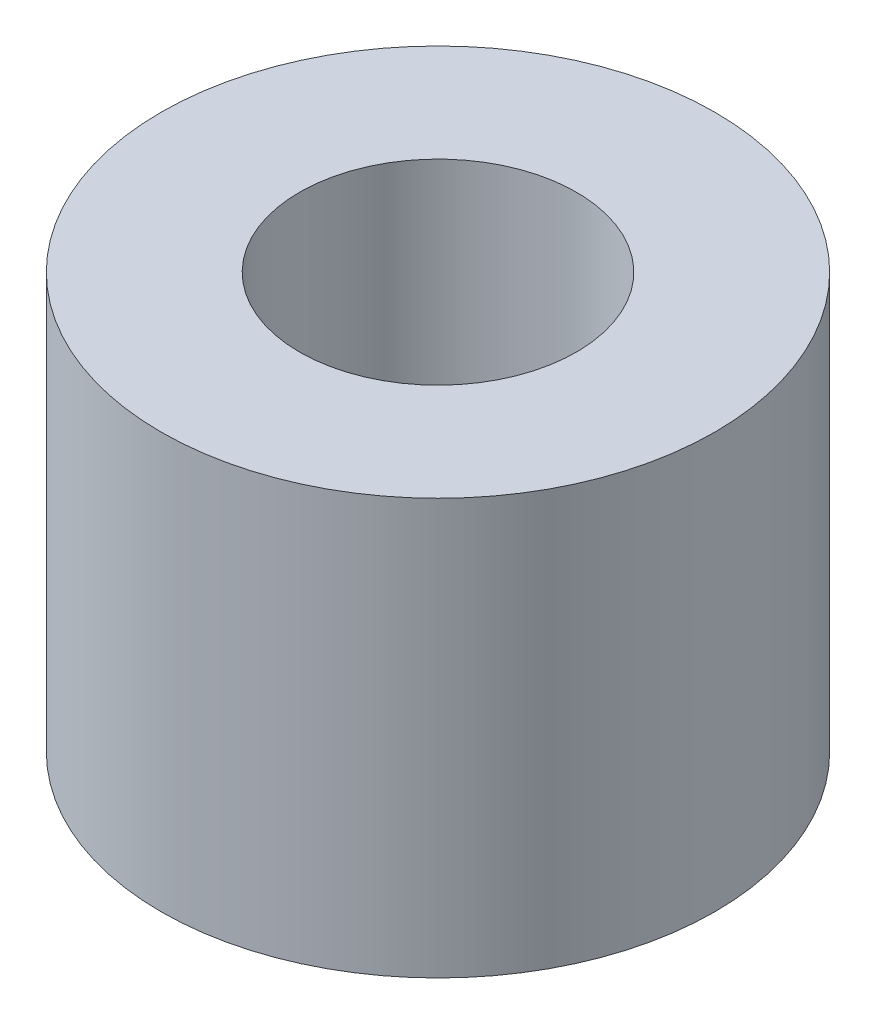
ISO-10303-21;
HEADER;
FILE_DESCRIPTION(('STEP AP214'),'2;1');
FILE_NAME('part.step','',(''),(''),'','','');
FILE_SCHEMA(('AUTOMOTIVE_DESIGN { 1 0 10303 214 1 1 1 1 }'));
ENDSEC;
DATA;
#1=APPLICATION_CONTEXT('core data for automotive mechanical design processes');
#2=APPLICATION_PROTOCOL_DEFINITION('international standard','automotive_design',2000,#1);
#3=PRODUCT_CONTEXT('',#1,'mechanical');
#4=PRODUCT('Part','Part','',(#3));
#5=PRODUCT_RELATED_PRODUCT_CATEGORY('part','',(#4));
#6=PRODUCT_DEFINITION_FORMATION('','',#4);
#7=PRODUCT_DEFINITION_CONTEXT('part definition',#1,'design');
#8=PRODUCT_DEFINITION('design','',#6,#7);
#9=PRODUCT_DEFINITION_SHAPE('','',#8);
#10=(LENGTH_UNIT() NAMED_UNIT(*) SI_UNIT(.MILLI.,.METRE.));
#11=(NAMED_UNIT(*) PLANE_ANGLE_UNIT() SI_UNIT($,.RADIAN.));
#12=(NAMED_UNIT(*) SI_UNIT($,.STERADIAN.) SOLID_ANGLE_UNIT());
#13=UNCERTAINTY_MEASURE_WITH_UNIT(LENGTH_MEASURE(1.E-05),#10,'distance_accuracy_value','');
#14=(GEOMETRIC_REPRESENTATION_CONTEXT(3) GLOBAL_UNCERTAINTY_ASSIGNED_CONTEXT((#13)) GLOBAL_UNIT_ASSIGNED_CONTEXT((#10,
#11,#12)) REPRESENTATION_CONTEXT('',''));
#15=CARTESIAN_POINT('',(0.,0.,0.));
#16=DIRECTION('',(0.,0.,1.));
#17=DIRECTION('',(1.,0.,0.));
#18=AXIS2_PLACEMENT_3D('',#15,#16,#17);
#19=CARTESIAN_POINT('',(0.,5.,0.));
#20=DIRECTION('',(0.,1.,0.));
#21=DIRECTION('',(0.,0.,1.));
#22=AXIS2_PLACEMENT_3D('',#19,#20,#21);
#23=PLANE('',#22);
#24=CARTESIAN_POINT('',(0.,5.,0.));
#25=DIRECTION('',(0.,1.,0.));
#26=DIRECTION('',(0.,0.,1.));
#27=AXIS2_PLACEMENT_3D('',#24,#25,#26);
#28=CIRCLE('',#27,4.);
#29=CARTESIAN_POINT('',(0.,5.,4.));
#30=VERTEX_POINT('',#29);
#31=EDGE_CURVE('E10',#30,#30,#28,.T.);
#32=ORIENTED_EDGE('',*,*,#31,.T.);
#33=EDGE_LOOP('',(#32));
#34=FACE_BOUND('',#33,.T.);
#35=CARTESIAN_POINT('',(0.,5.,0.));
#36=DIRECTION('',(0.,1.,0.));
#37=DIRECTION('',(0.,0.,1.));
#38=AXIS2_PLACEMENT_3D('',#35,#36,#37);
#39=CIRCLE('',#38,2.);
#40=CARTESIAN_POINT('',(0.,5.,2.));
#41=VERTEX_POINT('',#40);
#42=EDGE_CURVE('E38',#41,#41,#39,.T.);
#43=ORIENTED_EDGE('',*,*,#42,.F.);
#44=EDGE_LOOP('',(#43));
#45=FACE_BOUND('',#44,.T.);
#46=ADVANCED_FACE('F31',(#34,#45),#23,.T.);
#47=CARTESIAN_POINT('',(0.,5.,0.));
#48=DIRECTION('',(0.,-1.,0.));
#49=DIRECTION('',(0.,0.,-1.));
#50=AXIS2_PLACEMENT_3D('',#47,#48,#49);
#51=CYLINDRICAL_SURFACE('',#50,4.);
#52=ORIENTED_EDGE('',*,*,#31,.F.);
#53=EDGE_LOOP('',(#52));
#54=FACE_BOUND('',#53,.T.);
#55=CARTESIAN_POINT('',(0.,-1.,0.));
#56=DIRECTION('',(0.,-1.,0.));
#57=DIRECTION('',(0.,0.,-1.));
#58=AXIS2_PLACEMENT_3D('',#55,#56,#57);
#59=CIRCLE('',#58,4.);
#60=CARTESIAN_POINT('',(0.,-1.,-4.));
#61=VERTEX_POINT('',#60);
#62=EDGE_CURVE('E47',#61,#61,#59,.T.);
#63=ORIENTED_EDGE('',*,*,#62,.F.);
#64=EDGE_LOOP('',(#63));
#65=FACE_BOUND('',#64,.T.);
#66=ADVANCED_FACE('F33',(#54,#65),#51,.T.);
#67=CARTESIAN_POINT('',(0.,5.,0.));
#68=DIRECTION('',(0.,-1.,0.));
#69=DIRECTION('',(0.,0.,-1.));
#70=AXIS2_PLACEMENT_3D('',#67,#68,#69);
#71=CYLINDRICAL_SURFACE('',#70,2.);
#72=ORIENTED_EDGE('',*,*,#42,.T.);
#73=EDGE_LOOP('',(#72));
#74=FACE_BOUND('',#73,.T.);
#75=CARTESIAN_POINT('',(0.,0.,0.));
#76=DIRECTION('',(0.,1.,0.));
#77=DIRECTION('',(0.,0.,1.));
#78=AXIS2_PLACEMENT_3D('',#75,#76,#77);
#79=CIRCLE('',#78,2.);
#80=CARTESIAN_POINT('',(0.,0.,2.));
#81=VERTEX_POINT('',#80);
#82=EDGE_CURVE('E42',#81,#81,#79,.T.);
#83=ORIENTED_EDGE('',*,*,#82,.F.);
#84=EDGE_LOOP('',(#83));
#85=FACE_BOUND('',#84,.T.);
#86=ADVANCED_FACE('F55',(#74,#85),#71,.F.);
#87=CARTESIAN_POINT('',(0.,0.,0.));
#88=DIRECTION('',(0.,-1.,0.));
#89=DIRECTION('',(0.,0.,-1.));
#90=AXIS2_PLACEMENT_3D('',#87,#88,#89);
#91=PLANE('',#90);
#92=ORIENTED_EDGE('',*,*,#82,.T.);
#93=EDGE_LOOP('',(#92));
#94=FACE_BOUND('',#93,.T.);
#95=ADVANCED_FACE('F61',(#94),#91,.F.);
#96=CARTESIAN_POINT('',(0.,-1.,0.));
#97=DIRECTION('',(0.,-1.,0.));
#98=DIRECTION('',(0.,0.,-1.));
#99=AXIS2_PLACEMENT_3D('',#96,#97,#98);
#100=PLANE('',#99);
#101=ORIENTED_EDGE('',*,*,#62,.T.);
#102=EDGE_LOOP('',(#101));
#103=FACE_BOUND('',#102,.T.);
#104=ADVANCED_FACE('F52',(#103),#100,.T.);
#105=CLOSED_SHELL('',(#46,#66,#86,#95,#104));
#106=MANIFOLD_SOLID_BREP('B2',#105);
#107=ADVANCED_BREP_SHAPE_REPRESENTATION('',(#18,#106),#14);
#108=SHAPE_DEFINITION_REPRESENTATION(#9,#107);
ENDSEC;
END-ISO-10303-21;
